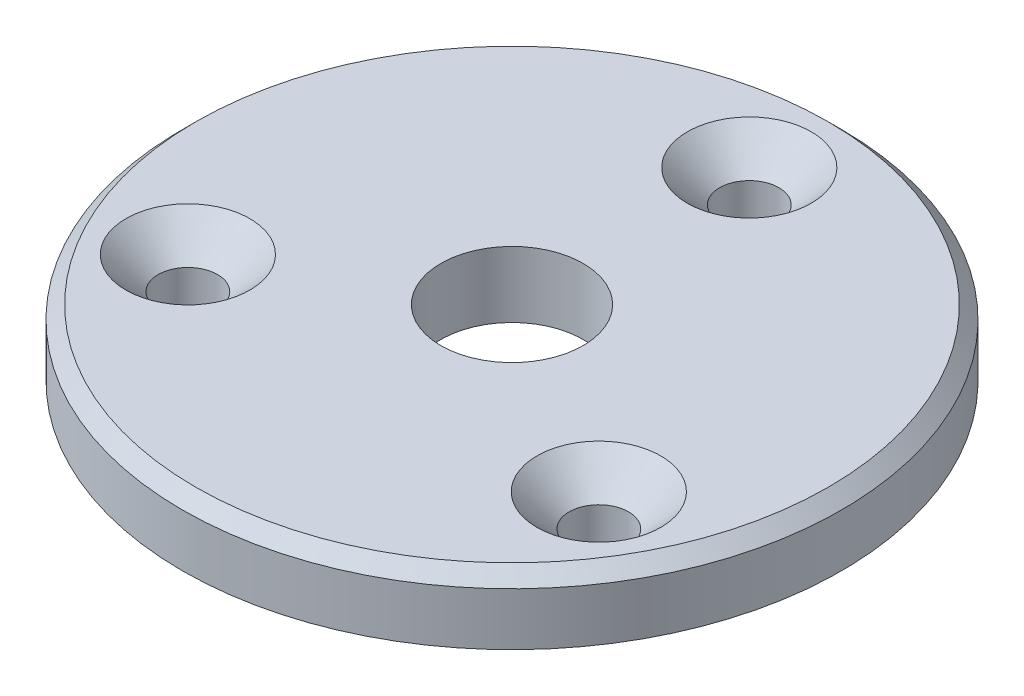
ISO-10303-21;
HEADER;
FILE_DESCRIPTION(('STEP AP214'),'2;1');
FILE_NAME('part.step','',(''),(''),'','','');
FILE_SCHEMA(('AUTOMOTIVE_DESIGN { 1 0 10303 214 1 1 1 1 }'));
ENDSEC;
DATA;
#1=APPLICATION_CONTEXT('core data for automotive mechanical design processes');
#2=APPLICATION_PROTOCOL_DEFINITION('international standard','automotive_design',2000,#1);
#3=PRODUCT_CONTEXT('',#1,'mechanical');
#4=PRODUCT('Part','Part','',(#3));
#5=PRODUCT_RELATED_PRODUCT_CATEGORY('part','',(#4));
#6=PRODUCT_DEFINITION_FORMATION('','',#4);
#7=PRODUCT_DEFINITION_CONTEXT('part definition',#1,'design');
#8=PRODUCT_DEFINITION('design','',#6,#7);
#9=PRODUCT_DEFINITION_SHAPE('','',#8);
#10=(LENGTH_UNIT() NAMED_UNIT(*) SI_UNIT(.MILLI.,.METRE.));
#11=(NAMED_UNIT(*) PLANE_ANGLE_UNIT() SI_UNIT($,.RADIAN.));
#12=(NAMED_UNIT(*) SI_UNIT($,.STERADIAN.) SOLID_ANGLE_UNIT());
#13=UNCERTAINTY_MEASURE_WITH_UNIT(LENGTH_MEASURE(1.E-05),#10,'distance_accuracy_value','');
#14=(GEOMETRIC_REPRESENTATION_CONTEXT(3) GLOBAL_UNCERTAINTY_ASSIGNED_CONTEXT((#13)) GLOBAL_UNIT_ASSIGNED_CONTEXT((#10,
#11,#12)) REPRESENTATION_CONTEXT('',''));
#15=CARTESIAN_POINT('',(0.,0.,0.));
#16=DIRECTION('',(0.,0.,1.));
#17=DIRECTION('',(1.,0.,0.));
#18=AXIS2_PLACEMENT_3D('',#15,#16,#17);
#19=CARTESIAN_POINT('',(0.,5.,0.));
#20=DIRECTION('',(0.,-1.,0.));
#21=DIRECTION('',(0.,0.,-1.));
#22=AXIS2_PLACEMENT_3D('',#19,#20,#21);
#23=CYLINDRICAL_SURFACE('',#22,25.);
#24=CARTESIAN_POINT('',(0.,4.,0.));
#25=DIRECTION('',(0.,1.,0.));
#26=DIRECTION('',(0.,0.,1.));
#27=AXIS2_PLACEMENT_3D('',#24,#25,#26);
#28=CIRCLE('',#27,25.);
#29=CARTESIAN_POINT('',(0.,4.,25.));
#30=VERTEX_POINT('',#29);
#31=EDGE_CURVE('E10',#30,#30,#28,.F.);
#32=ORIENTED_EDGE('',*,*,#31,.T.);
#33=EDGE_LOOP('',(#32));
#34=FACE_BOUND('',#33,.T.);
#35=CARTESIAN_POINT('',(0.,0.,0.));
#36=DIRECTION('',(0.,1.,0.));
#37=DIRECTION('',(0.,0.,1.));
#38=AXIS2_PLACEMENT_3D('',#35,#36,#37);
#39=CIRCLE('',#38,25.);
#40=CARTESIAN_POINT('',(0.,0.,25.));
#41=VERTEX_POINT('',#40);
#42=EDGE_CURVE('E45',#41,#41,#39,.T.);
#43=ORIENTED_EDGE('',*,*,#42,.T.);
#44=EDGE_LOOP('',(#43));
#45=FACE_BOUND('',#44,.T.);
#46=ADVANCED_FACE('F34',(#34,#45),#23,.T.);
#47=CARTESIAN_POINT('',(0.,5.,0.));
#48=DIRECTION('',(0.,1.,0.));
#49=DIRECTION('',(0.,0.,1.));
#50=AXIS2_PLACEMENT_3D('',#47,#48,#49);
#51=PLANE('',#50);
#52=CARTESIAN_POINT('',(-15.58845726812,5.,8.99999999999986));
#53=DIRECTION('',(0.,1.,0.));
#54=DIRECTION('',(0.,0.,1.));
#55=AXIS2_PLACEMENT_3D('',#52,#53,#54);
#56=CIRCLE('',#55,4.7);
#57=CARTESIAN_POINT('',(-15.58845726812,5.,13.6999999999999));
#58=VERTEX_POINT('',#57);
#59=EDGE_CURVE('E81',#58,#58,#56,.T.);
#60=ORIENTED_EDGE('',*,*,#59,.F.);
#61=EDGE_LOOP('',(#60));
#62=FACE_BOUND('',#61,.T.);
#63=CARTESIAN_POINT('',(15.5884572681199,5.,9.00000000000008));
#64=DIRECTION('',(0.,1.,0.));
#65=DIRECTION('',(0.,0.,1.));
#66=AXIS2_PLACEMENT_3D('',#63,#64,#65);
#67=CIRCLE('',#66,4.7);
#68=CARTESIAN_POINT('',(15.5884572681199,5.,13.7000000000001));
#69=VERTEX_POINT('',#68);
#70=EDGE_CURVE('E72',#69,#69,#67,.T.);
#71=ORIENTED_EDGE('',*,*,#70,.F.);
#72=EDGE_LOOP('',(#71));
#73=FACE_BOUND('',#72,.T.);
#74=CARTESIAN_POINT('',(0.,5.,0.));
#75=DIRECTION('',(0.,1.,0.));
#76=DIRECTION('',(0.,0.,1.));
#77=AXIS2_PLACEMENT_3D('',#74,#75,#76);
#78=CIRCLE('',#77,5.39999999999999);
#79=CARTESIAN_POINT('',(0.,5.,5.39999999999999));
#80=VERTEX_POINT('',#79);
#81=EDGE_CURVE('E63',#80,#80,#78,.T.);
#82=ORIENTED_EDGE('',*,*,#81,.F.);
#83=EDGE_LOOP('',(#82));
#84=FACE_BOUND('',#83,.T.);
#85=CARTESIAN_POINT('',(0.,5.,-18.));
#86=DIRECTION('',(0.,1.,0.));
#87=DIRECTION('',(0.,0.,1.));
#88=AXIS2_PLACEMENT_3D('',#85,#86,#87);
#89=CIRCLE('',#88,4.7);
#90=CARTESIAN_POINT('',(0.,5.,-13.3));
#91=VERTEX_POINT('',#90);
#92=EDGE_CURVE('E57',#91,#91,#89,.T.);
#93=ORIENTED_EDGE('',*,*,#92,.F.);
#94=EDGE_LOOP('',(#93));
#95=FACE_BOUND('',#94,.T.);
#96=CARTESIAN_POINT('',(0.,5.,0.));
#97=DIRECTION('',(0.,1.,0.));
#98=DIRECTION('',(0.,0.,1.));
#99=AXIS2_PLACEMENT_3D('',#96,#97,#98);
#100=CIRCLE('',#99,24.);
#101=CARTESIAN_POINT('',(0.,5.,24.));
#102=VERTEX_POINT('',#101);
#103=EDGE_CURVE('E41',#102,#102,#100,.T.);
#104=ORIENTED_EDGE('',*,*,#103,.T.);
#105=EDGE_LOOP('',(#104));
#106=FACE_BOUND('',#105,.T.);
#107=ADVANCED_FACE('F87',(#62,#73,#84,#95,#106),#51,.T.);
#108=CARTESIAN_POINT('',(0.,0.,0.));
#109=DIRECTION('',(0.,1.,0.));
#110=DIRECTION('',(0.,0.,1.));
#111=AXIS2_PLACEMENT_3D('',#108,#109,#110);
#112=PLANE('',#111);
#113=CARTESIAN_POINT('',(-15.58845726812,0.,8.99999999999986));
#114=DIRECTION('',(0.,1.,0.));
#115=DIRECTION('',(0.,0.,1.));
#116=AXIS2_PLACEMENT_3D('',#113,#114,#115);
#117=CIRCLE('',#116,2.25);
#118=CARTESIAN_POINT('',(-15.58845726812,0.,11.2499999999999));
#119=VERTEX_POINT('',#118);
#120=EDGE_CURVE('E75',#119,#119,#117,.T.);
#121=ORIENTED_EDGE('',*,*,#120,.T.);
#122=EDGE_LOOP('',(#121));
#123=FACE_BOUND('',#122,.T.);
#124=CARTESIAN_POINT('',(15.5884572681199,0.,9.00000000000008));
#125=DIRECTION('',(0.,1.,0.));
#126=DIRECTION('',(0.,0.,1.));
#127=AXIS2_PLACEMENT_3D('',#124,#125,#126);
#128=CIRCLE('',#127,2.25);
#129=CARTESIAN_POINT('',(15.5884572681199,0.,11.2500000000001));
#130=VERTEX_POINT('',#129);
#131=EDGE_CURVE('E66',#130,#130,#128,.T.);
#132=ORIENTED_EDGE('',*,*,#131,.T.);
#133=EDGE_LOOP('',(#132));
#134=FACE_BOUND('',#133,.T.);
#135=CARTESIAN_POINT('',(0.,0.,0.));
#136=DIRECTION('',(0.,1.,0.));
#137=DIRECTION('',(0.,0.,1.));
#138=AXIS2_PLACEMENT_3D('',#135,#136,#137);
#139=CIRCLE('',#138,5.4);
#140=CARTESIAN_POINT('',(0.,0.,5.4));
#141=VERTEX_POINT('',#140);
#142=EDGE_CURVE('E60',#141,#141,#139,.T.);
#143=ORIENTED_EDGE('',*,*,#142,.T.);
#144=EDGE_LOOP('',(#143));
#145=FACE_BOUND('',#144,.T.);
#146=CARTESIAN_POINT('',(0.,0.,-18.));
#147=DIRECTION('',(0.,1.,0.));
#148=DIRECTION('',(0.,0.,1.));
#149=AXIS2_PLACEMENT_3D('',#146,#147,#148);
#150=CIRCLE('',#149,2.25);
#151=CARTESIAN_POINT('',(0.,0.,-15.75));
#152=VERTEX_POINT('',#151);
#153=EDGE_CURVE('E49',#152,#152,#150,.T.);
#154=ORIENTED_EDGE('',*,*,#153,.T.);
#155=EDGE_LOOP('',(#154));
#156=FACE_BOUND('',#155,.T.);
#157=ORIENTED_EDGE('',*,*,#42,.F.);
#158=EDGE_LOOP('',(#157));
#159=FACE_BOUND('',#158,.T.);
#160=ADVANCED_FACE('F90',(#123,#134,#145,#156,#159),#112,.F.);
#161=CARTESIAN_POINT('',(0.,5.,0.));
#162=DIRECTION('',(0.,-1.,0.));
#163=DIRECTION('',(0.,0.,-1.));
#164=AXIS2_PLACEMENT_3D('',#161,#162,#163);
#165=CONICAL_SURFACE('',#164,24.,0.78539816339744);
#166=ORIENTED_EDGE('',*,*,#31,.F.);
#167=EDGE_LOOP('',(#166));
#168=FACE_BOUND('',#167,.T.);
#169=ORIENTED_EDGE('',*,*,#103,.F.);
#170=EDGE_LOOP('',(#169));
#171=FACE_BOUND('',#170,.T.);
#172=ADVANCED_FACE('F36',(#168,#171),#165,.T.);
#173=CARTESIAN_POINT('',(0.,5.,-18.));
#174=DIRECTION('',(0.,1.,0.));
#175=DIRECTION('',(0.,0.,1.));
#176=AXIS2_PLACEMENT_3D('',#173,#174,#175);
#177=CYLINDRICAL_SURFACE('',#176,2.25);
#178=ORIENTED_EDGE('',*,*,#153,.F.);
#179=EDGE_LOOP('',(#178));
#180=FACE_BOUND('',#179,.T.);
#181=CARTESIAN_POINT('',(0.,2.55,-18.));
#182=DIRECTION('',(0.,1.,0.));
#183=DIRECTION('',(0.,0.,1.));
#184=AXIS2_PLACEMENT_3D('',#181,#182,#183);
#185=CIRCLE('',#184,2.25);
#186=CARTESIAN_POINT('',(0.,2.55,-15.75));
#187=VERTEX_POINT('',#186);
#188=EDGE_CURVE('E54',#187,#187,#185,.T.);
#189=ORIENTED_EDGE('',*,*,#188,.T.);
#190=EDGE_LOOP('',(#189));
#191=FACE_BOUND('',#190,.T.);
#192=ADVANCED_FACE('F101',(#180,#191),#177,.F.);
#193=CARTESIAN_POINT('',(0.,5.,-18.));
#194=DIRECTION('',(0.,1.,0.));
#195=DIRECTION('',(0.,0.,1.));
#196=AXIS2_PLACEMENT_3D('',#193,#194,#195);
#197=CONICAL_SURFACE('',#196,4.7,0.785398163397448);
#198=ORIENTED_EDGE('',*,*,#188,.F.);
#199=EDGE_LOOP('',(#198));
#200=FACE_BOUND('',#199,.T.);
#201=ORIENTED_EDGE('',*,*,#92,.T.);
#202=EDGE_LOOP('',(#201));
#203=FACE_BOUND('',#202,.T.);
#204=ADVANCED_FACE('F98',(#200,#203),#197,.F.);
#205=CARTESIAN_POINT('',(0.,5.,0.));
#206=DIRECTION('',(0.,1.,0.));
#207=DIRECTION('',(0.,0.,1.));
#208=AXIS2_PLACEMENT_3D('',#205,#206,#207);
#209=CYLINDRICAL_SURFACE('',#208,5.39999999999999);
#210=ORIENTED_EDGE('',*,*,#142,.F.);
#211=EDGE_LOOP('',(#210));
#212=FACE_BOUND('',#211,.T.);
#213=ORIENTED_EDGE('',*,*,#81,.T.);
#214=EDGE_LOOP('',(#213));
#215=FACE_BOUND('',#214,.T.);
#216=ADVANCED_FACE('F100',(#212,#215),#209,.F.);
#217=CARTESIAN_POINT('',(15.5884572681199,5.,9.00000000000008));
#218=DIRECTION('',(0.,1.,0.));
#219=DIRECTION('',(0.,0.,1.));
#220=AXIS2_PLACEMENT_3D('',#217,#218,#219);
#221=CYLINDRICAL_SURFACE('',#220,2.25);
#222=ORIENTED_EDGE('',*,*,#131,.F.);
#223=EDGE_LOOP('',(#222));
#224=FACE_BOUND('',#223,.T.);
#225=CARTESIAN_POINT('',(15.5884572681199,2.55,9.00000000000008));
#226=DIRECTION('',(0.,1.,0.));
#227=DIRECTION('',(0.,0.,1.));
#228=AXIS2_PLACEMENT_3D('',#225,#226,#227);
#229=CIRCLE('',#228,2.25);
#230=CARTESIAN_POINT('',(15.5884572681199,2.55,11.2500000000001));
#231=VERTEX_POINT('',#230);
#232=EDGE_CURVE('E69',#231,#231,#229,.T.);
#233=ORIENTED_EDGE('',*,*,#232,.T.);
#234=EDGE_LOOP('',(#233));
#235=FACE_BOUND('',#234,.T.);
#236=ADVANCED_FACE('F108',(#224,#235),#221,.F.);
#237=CARTESIAN_POINT('',(15.5884572681199,5.,9.00000000000008));
#238=DIRECTION('',(0.,1.,0.));
#239=DIRECTION('',(0.,0.,1.));
#240=AXIS2_PLACEMENT_3D('',#237,#238,#239);
#241=CONICAL_SURFACE('',#240,4.7,0.785398163397449);
#242=ORIENTED_EDGE('',*,*,#232,.F.);
#243=EDGE_LOOP('',(#242));
#244=FACE_BOUND('',#243,.T.);
#245=ORIENTED_EDGE('',*,*,#70,.T.);
#246=EDGE_LOOP('',(#245));
#247=FACE_BOUND('',#246,.T.);
#248=ADVANCED_FACE('F139',(#244,#247),#241,.F.);
#249=CARTESIAN_POINT('',(-15.58845726812,5.,8.99999999999986));
#250=DIRECTION('',(0.,1.,0.));
#251=DIRECTION('',(0.,0.,1.));
#252=AXIS2_PLACEMENT_3D('',#249,#250,#251);
#253=CYLINDRICAL_SURFACE('',#252,2.25);
#254=ORIENTED_EDGE('',*,*,#120,.F.);
#255=EDGE_LOOP('',(#254));
#256=FACE_BOUND('',#255,.T.);
#257=CARTESIAN_POINT('',(-15.58845726812,2.55,8.99999999999986));
#258=DIRECTION('',(0.,1.,0.));
#259=DIRECTION('',(0.,0.,1.));
#260=AXIS2_PLACEMENT_3D('',#257,#258,#259);
#261=CIRCLE('',#260,2.25);
#262=CARTESIAN_POINT('',(-15.58845726812,2.55,11.2499999999999));
#263=VERTEX_POINT('',#262);
#264=EDGE_CURVE('E78',#263,#263,#261,.T.);
#265=ORIENTED_EDGE('',*,*,#264,.T.);
#266=EDGE_LOOP('',(#265));
#267=FACE_BOUND('',#266,.T.);
#268=ADVANCED_FACE('F145',(#256,#267),#253,.F.);
#269=CARTESIAN_POINT('',(-15.58845726812,5.,8.99999999999986));
#270=DIRECTION('',(0.,1.,0.));
#271=DIRECTION('',(0.,0.,1.));
#272=AXIS2_PLACEMENT_3D('',#269,#270,#271);
#273=CONICAL_SURFACE('',#272,4.7,0.785398163397449);
#274=ORIENTED_EDGE('',*,*,#264,.F.);
#275=EDGE_LOOP('',(#274));
#276=FACE_BOUND('',#275,.T.);
#277=ORIENTED_EDGE('',*,*,#59,.T.);
#278=EDGE_LOOP('',(#277));
#279=FACE_BOUND('',#278,.T.);
#280=ADVANCED_FACE('F85',(#276,#279),#273,.F.);
#281=CLOSED_SHELL('',(#46,#107,#160,#172,#192,#204,#216,#236,#248,#268,#280));
#282=MANIFOLD_SOLID_BREP('B2',#281);
#283=ADVANCED_BREP_SHAPE_REPRESENTATION('',(#18,#282),#14);
#284=SHAPE_DEFINITION_REPRESENTATION(#9,#283);
ENDSEC;
END-ISO-10303-21;
